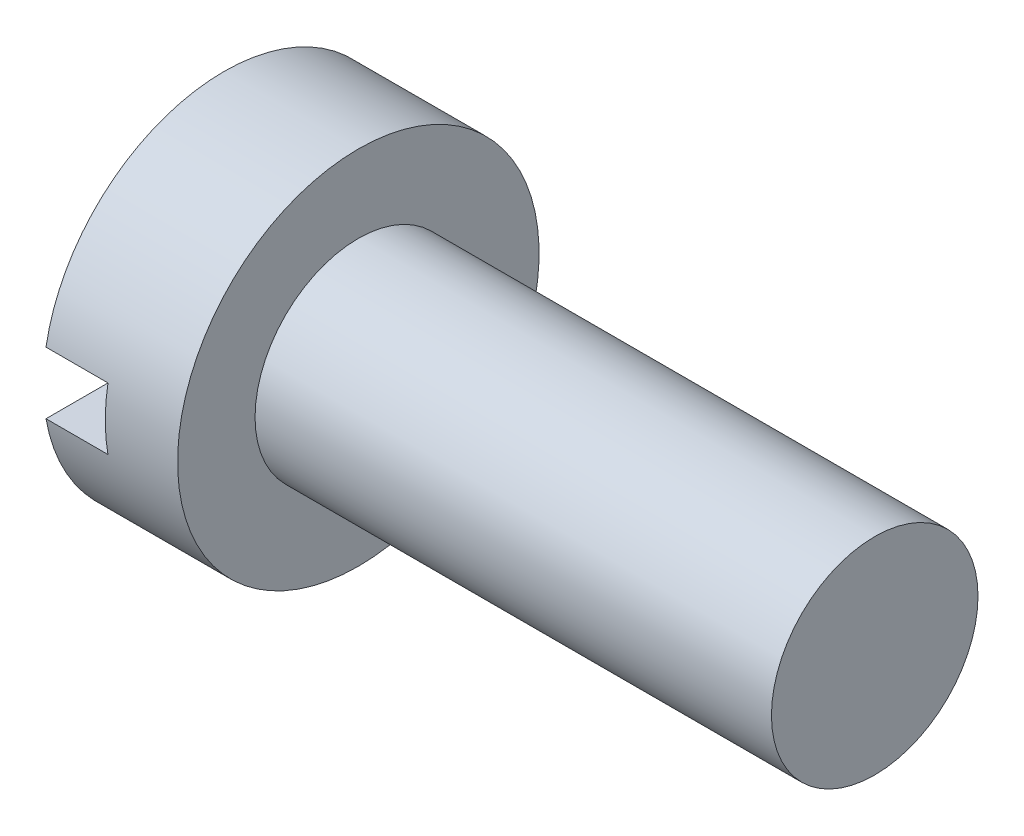
ISO-10303-21;
HEADER;
FILE_DESCRIPTION(('STEP AP214'),'2;1');
FILE_NAME('part.step','',(''),(''),'','','');
FILE_SCHEMA(('AUTOMOTIVE_DESIGN { 1 0 10303 214 1 1 1 1 }'));
ENDSEC;
DATA;
#1=APPLICATION_CONTEXT('core data for automotive mechanical design processes');
#2=APPLICATION_PROTOCOL_DEFINITION('international standard','automotive_design',2000,#1);
#3=PRODUCT_CONTEXT('',#1,'mechanical');
#4=PRODUCT('Part','Part','',(#3));
#5=PRODUCT_RELATED_PRODUCT_CATEGORY('part','',(#4));
#6=PRODUCT_DEFINITION_FORMATION('','',#4);
#7=PRODUCT_DEFINITION_CONTEXT('part definition',#1,'design');
#8=PRODUCT_DEFINITION('design','',#6,#7);
#9=PRODUCT_DEFINITION_SHAPE('','',#8);
#10=(LENGTH_UNIT() NAMED_UNIT(*) SI_UNIT(.MILLI.,.METRE.));
#11=(NAMED_UNIT(*) PLANE_ANGLE_UNIT() SI_UNIT($,.RADIAN.));
#12=(NAMED_UNIT(*) SI_UNIT($,.STERADIAN.) SOLID_ANGLE_UNIT());
#13=UNCERTAINTY_MEASURE_WITH_UNIT(LENGTH_MEASURE(1.E-05),#10,'distance_accuracy_value','');
#14=(GEOMETRIC_REPRESENTATION_CONTEXT(3) GLOBAL_UNCERTAINTY_ASSIGNED_CONTEXT((#13)) GLOBAL_UNIT_ASSIGNED_CONTEXT((#10,
#11,#12)) REPRESENTATION_CONTEXT('',''));
#15=CARTESIAN_POINT('',(0.,0.,0.));
#16=DIRECTION('',(0.,0.,1.));
#17=DIRECTION('',(1.,0.,0.));
#18=AXIS2_PLACEMENT_3D('',#15,#16,#17);
#19=CARTESIAN_POINT('',(0.,0.,0.));
#20=DIRECTION('',(-1.,0.,0.));
#21=DIRECTION('',(0.,-1.,0.));
#22=AXIS2_PLACEMENT_3D('',#19,#20,#21);
#23=PLANE('',#22);
#24=DIRECTION('',(0.,0.,-1.));
#25=VECTOR('',#24,1.);
#26=CARTESIAN_POINT('',(0.,0.599999999999996,-3.5));
#27=LINE('',#26,#25);
#28=CARTESIAN_POINT('',(0.,0.599999999999999,3.44818792991333));
#29=VERTEX_POINT('',#28);
#30=CARTESIAN_POINT('',(0.,0.599999999999996,-3.44818792991333));
#31=VERTEX_POINT('',#30);
#32=EDGE_CURVE('E83',#29,#31,#27,.T.);
#33=ORIENTED_EDGE('',*,*,#32,.F.);
#34=CARTESIAN_POINT('',(0.,0.,0.));
#35=DIRECTION('',(1.,0.,0.));
#36=DIRECTION('',(0.,1.,0.));
#37=AXIS2_PLACEMENT_3D('',#34,#35,#36);
#38=CIRCLE('',#37,3.5);
#39=EDGE_CURVE('E89',#31,#29,#38,.T.);
#40=ORIENTED_EDGE('',*,*,#39,.F.);
#41=EDGE_LOOP('',(#33,#40));
#42=FACE_BOUND('',#41,.T.);
#43=ADVANCED_FACE('F33',(#42),#23,.T.);
#44=DIRECTION('',(0.,0.,1.));
#45=VECTOR('',#44,1.);
#46=CARTESIAN_POINT('',(0.,-0.600000000000001,-3.5));
#47=LINE('',#46,#45);
#48=CARTESIAN_POINT('',(0.,-0.600000000000001,-3.44818792991333));
#49=VERTEX_POINT('',#48);
#50=CARTESIAN_POINT('',(0.,-0.599999999999999,3.44818792991333));
#51=VERTEX_POINT('',#50);
#52=EDGE_CURVE('E77',#49,#51,#47,.T.);
#53=ORIENTED_EDGE('',*,*,#52,.F.);
#54=EDGE_CURVE('E82',#51,#49,#38,.T.);
#55=ORIENTED_EDGE('',*,*,#54,.F.);
#56=EDGE_LOOP('',(#53,#55));
#57=FACE_BOUND('',#56,.T.);
#58=ADVANCED_FACE('F35',(#57),#23,.T.);
#59=CARTESIAN_POINT('',(12.6,0.,0.));
#60=DIRECTION('',(1.,0.,0.));
#61=DIRECTION('',(0.,1.,0.));
#62=AXIS2_PLACEMENT_3D('',#59,#60,#61);
#63=CYLINDRICAL_SURFACE('',#62,3.5);
#64=DIRECTION('',(1.,0.,0.));
#65=VECTOR('',#64,1.);
#66=CARTESIAN_POINT('',(12.6,0.599999999999996,-3.44818792991333));
#67=LINE('',#66,#65);
#68=CARTESIAN_POINT('',(1.2,0.599999999999996,-3.44818792991333));
#69=VERTEX_POINT('',#68);
#70=EDGE_CURVE('E11',#31,#69,#67,.T.);
#71=ORIENTED_EDGE('',*,*,#70,.F.);
#72=ORIENTED_EDGE('',*,*,#39,.T.);
#73=DIRECTION('',(1.,0.,0.));
#74=VECTOR('',#73,1.);
#75=CARTESIAN_POINT('',(12.6,0.599999999999999,3.44818792991333));
#76=LINE('',#75,#74);
#77=CARTESIAN_POINT('',(1.2,0.599999999999999,3.44818792991333));
#78=VERTEX_POINT('',#77);
#79=EDGE_CURVE('E98',#78,#29,#76,.F.);
#80=ORIENTED_EDGE('',*,*,#79,.F.);
#81=CARTESIAN_POINT('',(1.2,0.,0.));
#82=DIRECTION('',(-1.,0.,0.));
#83=DIRECTION('',(0.,0.,1.));
#84=AXIS2_PLACEMENT_3D('',#81,#82,#83);
#85=CIRCLE('',#84,3.5);
#86=CARTESIAN_POINT('',(1.2,-0.599999999999999,3.44818792991333));
#87=VERTEX_POINT('',#86);
#88=EDGE_CURVE('E48',#78,#87,#85,.F.);
#89=ORIENTED_EDGE('',*,*,#88,.T.);
#90=DIRECTION('',(1.,0.,0.));
#91=VECTOR('',#90,1.);
#92=CARTESIAN_POINT('',(12.6,-0.599999999999999,3.44818792991333));
#93=LINE('',#92,#91);
#94=EDGE_CURVE('E88',#51,#87,#93,.T.);
#95=ORIENTED_EDGE('',*,*,#94,.F.);
#96=ORIENTED_EDGE('',*,*,#54,.T.);
#97=DIRECTION('',(1.,0.,0.));
#98=VECTOR('',#97,1.);
#99=CARTESIAN_POINT('',(12.6,-0.600000000000001,-3.44818792991333));
#100=LINE('',#99,#98);
#101=CARTESIAN_POINT('',(1.2,-0.600000000000001,-3.44818792991333));
#102=VERTEX_POINT('',#101);
#103=EDGE_CURVE('E41',#102,#49,#100,.F.);
#104=ORIENTED_EDGE('',*,*,#103,.F.);
#105=EDGE_CURVE('E56',#102,#69,#85,.F.);
#106=ORIENTED_EDGE('',*,*,#105,.T.);
#107=EDGE_LOOP('',(#71,#72,#80,#89,#95,#96,#104,#106));
#108=FACE_BOUND('',#107,.T.);
#109=CARTESIAN_POINT('',(2.6,0.,0.));
#110=DIRECTION('',(1.,0.,0.));
#111=DIRECTION('',(0.,1.,0.));
#112=AXIS2_PLACEMENT_3D('',#109,#110,#111);
#113=CIRCLE('',#112,3.5);
#114=CARTESIAN_POINT('',(2.6,3.5,0.));
#115=VERTEX_POINT('',#114);
#116=EDGE_CURVE('E93',#115,#115,#113,.T.);
#117=ORIENTED_EDGE('',*,*,#116,.F.);
#118=EDGE_LOOP('',(#117));
#119=FACE_BOUND('',#118,.T.);
#120=ADVANCED_FACE('F86',(#108,#119),#63,.T.);
#121=CARTESIAN_POINT('',(2.6,3.5,0.));
#122=DIRECTION('',(1.,0.,0.));
#123=DIRECTION('',(0.,1.,0.));
#124=AXIS2_PLACEMENT_3D('',#121,#122,#123);
#125=PLANE('',#124);
#126=ORIENTED_EDGE('',*,*,#116,.T.);
#127=EDGE_LOOP('',(#126));
#128=FACE_BOUND('',#127,.T.);
#129=CARTESIAN_POINT('',(2.6,0.,0.));
#130=DIRECTION('',(1.,0.,0.));
#131=DIRECTION('',(0.,1.,0.));
#132=AXIS2_PLACEMENT_3D('',#129,#130,#131);
#133=CIRCLE('',#132,2.);
#134=CARTESIAN_POINT('',(2.6,2.,0.));
#135=VERTEX_POINT('',#134);
#136=EDGE_CURVE('E111',#135,#135,#133,.T.);
#137=ORIENTED_EDGE('',*,*,#136,.F.);
#138=EDGE_LOOP('',(#137));
#139=FACE_BOUND('',#138,.T.);
#140=ADVANCED_FACE('F118',(#128,#139),#125,.T.);
#141=CARTESIAN_POINT('',(12.6,0.,0.));
#142=DIRECTION('',(1.,0.,0.));
#143=DIRECTION('',(0.,1.,0.));
#144=AXIS2_PLACEMENT_3D('',#141,#142,#143);
#145=CYLINDRICAL_SURFACE('',#144,2.);
#146=ORIENTED_EDGE('',*,*,#136,.T.);
#147=EDGE_LOOP('',(#146));
#148=FACE_BOUND('',#147,.T.);
#149=CARTESIAN_POINT('',(12.6,0.,0.));
#150=DIRECTION('',(1.,0.,0.));
#151=DIRECTION('',(0.,1.,0.));
#152=AXIS2_PLACEMENT_3D('',#149,#150,#151);
#153=CIRCLE('',#152,2.);
#154=CARTESIAN_POINT('',(12.6,2.,0.));
#155=VERTEX_POINT('',#154);
#156=EDGE_CURVE('E109',#155,#155,#153,.T.);
#157=ORIENTED_EDGE('',*,*,#156,.F.);
#158=EDGE_LOOP('',(#157));
#159=FACE_BOUND('',#158,.T.);
#160=ADVANCED_FACE('F125',(#148,#159),#145,.T.);
#161=CARTESIAN_POINT('',(12.6,2.,0.));
#162=DIRECTION('',(1.,0.,0.));
#163=DIRECTION('',(0.,1.,0.));
#164=AXIS2_PLACEMENT_3D('',#161,#162,#163);
#165=PLANE('',#164);
#166=ORIENTED_EDGE('',*,*,#156,.T.);
#167=EDGE_LOOP('',(#166));
#168=FACE_BOUND('',#167,.T.);
#169=ADVANCED_FACE('F150',(#168),#165,.T.);
#170=CARTESIAN_POINT('',(1.2,0.599999999999996,-3.5));
#171=DIRECTION('',(0.,1.,0.));
#172=DIRECTION('',(0.,0.,1.));
#173=AXIS2_PLACEMENT_3D('',#170,#171,#172);
#174=PLANE('',#173);
#175=ORIENTED_EDGE('',*,*,#79,.T.);
#176=ORIENTED_EDGE('',*,*,#32,.T.);
#177=ORIENTED_EDGE('',*,*,#70,.T.);
#178=DIRECTION('',(0.,0.,-1.));
#179=VECTOR('',#178,1.);
#180=CARTESIAN_POINT('',(1.2,0.599999999999996,-3.5));
#181=LINE('',#180,#179);
#182=EDGE_CURVE('E105',#78,#69,#181,.T.);
#183=ORIENTED_EDGE('',*,*,#182,.F.);
#184=EDGE_LOOP('',(#175,#176,#177,#183));
#185=FACE_BOUND('',#184,.T.);
#186=ADVANCED_FACE('F145',(#185),#174,.F.);
#187=CARTESIAN_POINT('',(1.2,-0.600000000000001,-3.5));
#188=DIRECTION('',(0.,-1.,0.));
#189=DIRECTION('',(0.,0.,-1.));
#190=AXIS2_PLACEMENT_3D('',#187,#188,#189);
#191=PLANE('',#190);
#192=ORIENTED_EDGE('',*,*,#103,.T.);
#193=ORIENTED_EDGE('',*,*,#52,.T.);
#194=ORIENTED_EDGE('',*,*,#94,.T.);
#195=DIRECTION('',(0.,0.,1.));
#196=VECTOR('',#195,1.);
#197=CARTESIAN_POINT('',(1.2,-0.600000000000001,-3.5));
#198=LINE('',#197,#196);
#199=EDGE_CURVE('E78',#102,#87,#198,.T.);
#200=ORIENTED_EDGE('',*,*,#199,.F.);
#201=EDGE_LOOP('',(#192,#193,#194,#200));
#202=FACE_BOUND('',#201,.T.);
#203=ADVANCED_FACE('F76',(#202),#191,.F.);
#204=CARTESIAN_POINT('',(1.2,0.,0.));
#205=DIRECTION('',(-1.,0.,0.));
#206=DIRECTION('',(0.,0.,1.));
#207=AXIS2_PLACEMENT_3D('',#204,#205,#206);
#208=PLANE('',#207);
#209=ORIENTED_EDGE('',*,*,#199,.T.);
#210=ORIENTED_EDGE('',*,*,#88,.F.);
#211=ORIENTED_EDGE('',*,*,#182,.T.);
#212=ORIENTED_EDGE('',*,*,#105,.F.);
#213=EDGE_LOOP('',(#209,#210,#211,#212));
#214=FACE_BOUND('',#213,.T.);
#215=ADVANCED_FACE('F160',(#214),#208,.T.);
#216=CLOSED_SHELL('',(#43,#58,#120,#140,#160,#169,#186,#203,#215));
#217=MANIFOLD_SOLID_BREP('B2',#216);
#218=ADVANCED_BREP_SHAPE_REPRESENTATION('',(#18,#217),#14);
#219=SHAPE_DEFINITION_REPRESENTATION(#9,#218);
ENDSEC;
END-ISO-10303-21;
